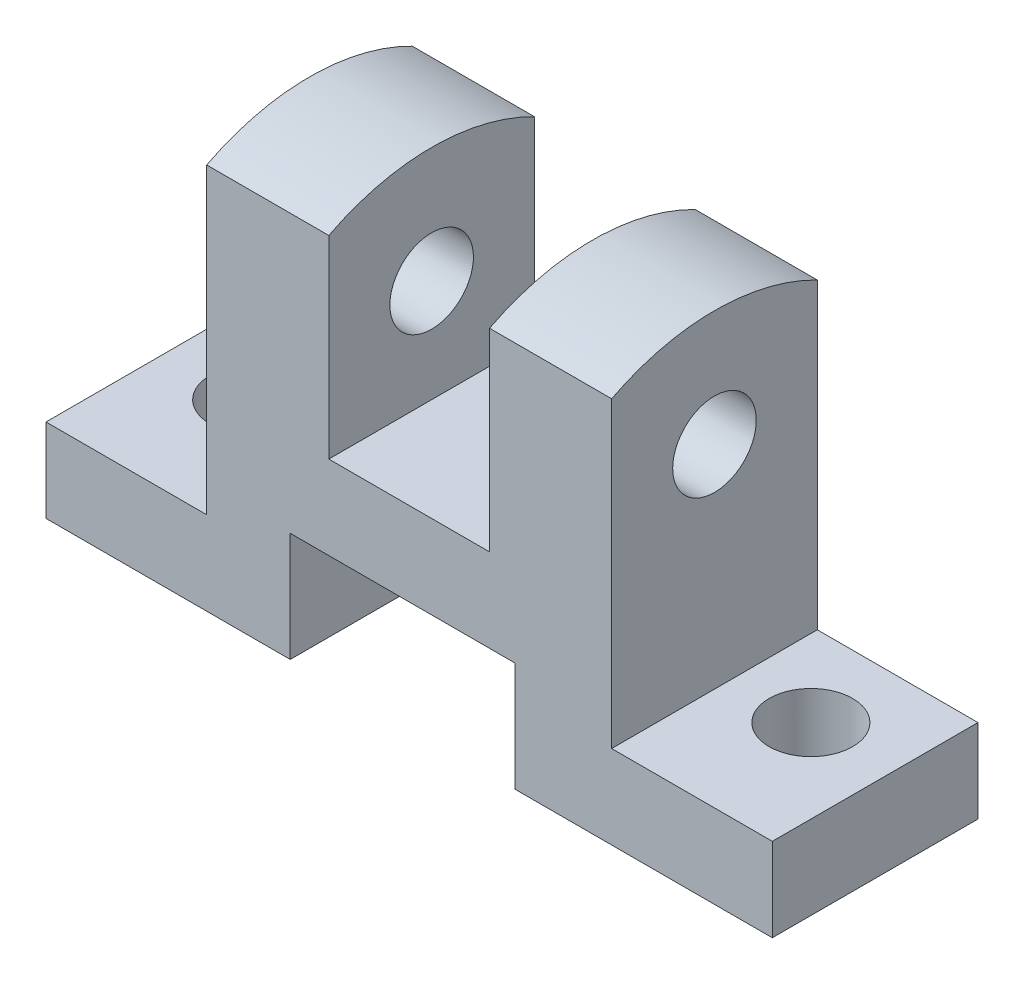
ISO-10303-21;
HEADER;
FILE_DESCRIPTION(('STEP AP214'),'2;1');
FILE_NAME('part.step','',(''),(''),'','','');
FILE_SCHEMA(('AUTOMOTIVE_DESIGN { 1 0 10303 214 1 1 1 1 }'));
ENDSEC;
DATA;
#1=APPLICATION_CONTEXT('core data for automotive mechanical design processes');
#2=APPLICATION_PROTOCOL_DEFINITION('international standard','automotive_design',2000,#1);
#3=PRODUCT_CONTEXT('',#1,'mechanical');
#4=PRODUCT('Part','Part','',(#3));
#5=PRODUCT_RELATED_PRODUCT_CATEGORY('part','',(#4));
#6=PRODUCT_DEFINITION_FORMATION('','',#4);
#7=PRODUCT_DEFINITION_CONTEXT('part definition',#1,'design');
#8=PRODUCT_DEFINITION('design','',#6,#7);
#9=PRODUCT_DEFINITION_SHAPE('','',#8);
#10=(LENGTH_UNIT() NAMED_UNIT(*) SI_UNIT(.MILLI.,.METRE.));
#11=(NAMED_UNIT(*) PLANE_ANGLE_UNIT() SI_UNIT($,.RADIAN.));
#12=(NAMED_UNIT(*) SI_UNIT($,.STERADIAN.) SOLID_ANGLE_UNIT());
#13=UNCERTAINTY_MEASURE_WITH_UNIT(LENGTH_MEASURE(1.E-05),#10,'distance_accuracy_value','');
#14=(GEOMETRIC_REPRESENTATION_CONTEXT(3) GLOBAL_UNCERTAINTY_ASSIGNED_CONTEXT((#13)) GLOBAL_UNIT_ASSIGNED_CONTEXT((#10,
#11,#12)) REPRESENTATION_CONTEXT('',''));
#15=CARTESIAN_POINT('',(0.,0.,0.));
#16=DIRECTION('',(0.,0.,1.));
#17=DIRECTION('',(1.,0.,0.));
#18=AXIS2_PLACEMENT_3D('',#15,#16,#17);
#19=CARTESIAN_POINT('',(23.1227868642223,-12.117917581086,32.));
#20=DIRECTION('',(-1.,0.,0.));
#21=DIRECTION('',(0.,0.,1.));
#22=AXIS2_PLACEMENT_3D('',#19,#20,#21);
#23=PLANE('',#22);
#24=CARTESIAN_POINT('',(23.1227868642223,20.882082418914,16.));
#25=DIRECTION('',(-1.,0.,0.));
#26=DIRECTION('',(0.,0.,1.));
#27=AXIS2_PLACEMENT_3D('',#24,#25,#26);
#28=CIRCLE('',#27,6.5);
#29=CARTESIAN_POINT('',(23.1227868642223,20.882082418914,22.5));
#30=VERTEX_POINT('',#29);
#31=EDGE_CURVE('E297',#30,#30,#28,.T.);
#32=ORIENTED_EDGE('',*,*,#31,.T.);
#33=EDGE_LOOP('',(#32));
#34=FACE_BOUND('',#33,.T.);
#35=DIRECTION('',(0.,1.,0.));
#36=VECTOR('',#35,1.);
#37=CARTESIAN_POINT('',(23.1227868642223,-12.117917581086,0.));
#38=LINE('',#37,#36);
#39=CARTESIAN_POINT('',(23.1227868642223,-12.117917581086,0.));
#40=VERTEX_POINT('',#39);
#41=CARTESIAN_POINT('',(23.1227868642223,35.0108472514607,0.));
#42=VERTEX_POINT('',#41);
#43=EDGE_CURVE('E271',#40,#42,#38,.T.);
#44=ORIENTED_EDGE('',*,*,#43,.T.);
#45=CARTESIAN_POINT('',(23.1227868642223,3.88208241891396,16.));
#46=DIRECTION('',(-1.,0.,0.));
#47=DIRECTION('',(0.,0.,1.));
#48=AXIS2_PLACEMENT_3D('',#45,#46,#47);
#49=CIRCLE('',#48,35.);
#50=CARTESIAN_POINT('',(23.1227868642223,35.0108472514607,32.));
#51=VERTEX_POINT('',#50);
#52=EDGE_CURVE('E284',#51,#42,#49,.T.);
#53=ORIENTED_EDGE('',*,*,#52,.F.);
#54=DIRECTION('',(0.,1.,0.));
#55=VECTOR('',#54,1.);
#56=CARTESIAN_POINT('',(23.1227868642223,-12.117917581086,32.));
#57=LINE('',#56,#55);
#58=CARTESIAN_POINT('',(23.1227868642223,-12.117917581086,32.));
#59=VERTEX_POINT('',#58);
#60=EDGE_CURVE('E239',#59,#51,#57,.T.);
#61=ORIENTED_EDGE('',*,*,#60,.F.);
#62=DIRECTION('',(0.,0.,-1.));
#63=VECTOR('',#62,1.);
#64=CARTESIAN_POINT('',(23.1227868642223,-12.117917581086,32.));
#65=LINE('',#64,#63);
#66=EDGE_CURVE('E216',#59,#40,#65,.T.);
#67=ORIENTED_EDGE('',*,*,#66,.T.);
#68=EDGE_LOOP('',(#44,#53,#61,#67));
#69=FACE_BOUND('',#68,.T.);
#70=ADVANCED_FACE('F35',(#34,#69),#23,.F.);
#71=CARTESIAN_POINT('',(4.12278686422227,38.882082418914,32.));
#72=DIRECTION('',(1.,0.,0.));
#73=DIRECTION('',(0.,1.,0.));
#74=AXIS2_PLACEMENT_3D('',#71,#72,#73);
#75=PLANE('',#74);
#76=CARTESIAN_POINT('',(4.12278686422227,20.882082418914,16.));
#77=DIRECTION('',(1.,0.,0.));
#78=DIRECTION('',(0.,1.,0.));
#79=AXIS2_PLACEMENT_3D('',#76,#77,#78);
#80=CIRCLE('',#79,6.5);
#81=CARTESIAN_POINT('',(4.12278686422227,27.382082418914,16.));
#82=VERTEX_POINT('',#81);
#83=EDGE_CURVE('E294',#82,#82,#80,.T.);
#84=ORIENTED_EDGE('',*,*,#83,.T.);
#85=EDGE_LOOP('',(#84));
#86=FACE_BOUND('',#85,.T.);
#87=CARTESIAN_POINT('',(4.12278686422227,3.88208241891396,16.));
#88=DIRECTION('',(1.,0.,0.));
#89=DIRECTION('',(0.,1.,0.));
#90=AXIS2_PLACEMENT_3D('',#87,#88,#89);
#91=CIRCLE('',#90,35.);
#92=CARTESIAN_POINT('',(4.12278686422227,35.0108472514607,0.));
#93=VERTEX_POINT('',#92);
#94=CARTESIAN_POINT('',(4.12278686422227,35.0108472514607,32.));
#95=VERTEX_POINT('',#94);
#96=EDGE_CURVE('E57',#93,#95,#91,.T.);
#97=ORIENTED_EDGE('',*,*,#96,.F.);
#98=DIRECTION('',(0.,-1.,0.));
#99=VECTOR('',#98,1.);
#100=CARTESIAN_POINT('',(4.12278686422227,38.882082418914,0.));
#101=LINE('',#100,#99);
#102=CARTESIAN_POINT('',(4.12278686422227,4.88208241891397,0.));
#103=VERTEX_POINT('',#102);
#104=EDGE_CURVE('E274',#93,#103,#101,.T.);
#105=ORIENTED_EDGE('',*,*,#104,.T.);
#106=DIRECTION('',(0.,0.,-1.));
#107=VECTOR('',#106,1.);
#108=CARTESIAN_POINT('',(4.12278686422227,4.88208241891397,32.));
#109=LINE('',#108,#107);
#110=CARTESIAN_POINT('',(4.12278686422227,4.88208241891397,32.));
#111=VERTEX_POINT('',#110);
#112=EDGE_CURVE('E213',#111,#103,#109,.T.);
#113=ORIENTED_EDGE('',*,*,#112,.F.);
#114=DIRECTION('',(0.,-1.,0.));
#115=VECTOR('',#114,1.);
#116=CARTESIAN_POINT('',(4.12278686422227,38.882082418914,32.));
#117=LINE('',#116,#115);
#118=EDGE_CURVE('E236',#95,#111,#117,.T.);
#119=ORIENTED_EDGE('',*,*,#118,.F.);
#120=EDGE_LOOP('',(#97,#105,#113,#119));
#121=FACE_BOUND('',#120,.T.);
#122=ADVANCED_FACE('F242',(#86,#121),#75,.F.);
#123=CARTESIAN_POINT('',(-20.8772131357777,4.88208241891397,32.));
#124=DIRECTION('',(-1.,0.,0.));
#125=DIRECTION('',(0.,-1.,0.));
#126=AXIS2_PLACEMENT_3D('',#123,#124,#125);
#127=PLANE('',#126);
#128=CARTESIAN_POINT('',(-20.8772131357777,20.882082418914,16.));
#129=DIRECTION('',(-1.,0.,0.));
#130=DIRECTION('',(0.,-1.,0.));
#131=AXIS2_PLACEMENT_3D('',#128,#129,#130);
#132=CIRCLE('',#131,6.5);
#133=CARTESIAN_POINT('',(-20.8772131357777,14.382082418914,16.));
#134=VERTEX_POINT('',#133);
#135=EDGE_CURVE('E291',#134,#134,#132,.T.);
#136=ORIENTED_EDGE('',*,*,#135,.T.);
#137=EDGE_LOOP('',(#136));
#138=FACE_BOUND('',#137,.T.);
#139=DIRECTION('',(0.,1.,0.));
#140=VECTOR('',#139,1.);
#141=CARTESIAN_POINT('',(-20.8772131357777,4.88208241891397,0.));
#142=LINE('',#141,#140);
#143=CARTESIAN_POINT('',(-20.8772131357777,4.88208241891397,0.));
#144=VERTEX_POINT('',#143);
#145=CARTESIAN_POINT('',(-20.8772131357777,35.0108472514607,0.));
#146=VERTEX_POINT('',#145);
#147=EDGE_CURVE('E166',#144,#146,#142,.T.);
#148=ORIENTED_EDGE('',*,*,#147,.T.);
#149=CARTESIAN_POINT('',(-20.8772131357777,3.88208241891396,16.));
#150=DIRECTION('',(-1.,0.,0.));
#151=DIRECTION('',(0.,-1.,0.));
#152=AXIS2_PLACEMENT_3D('',#149,#150,#151);
#153=CIRCLE('',#152,35.);
#154=CARTESIAN_POINT('',(-20.8772131357777,35.0108472514607,32.));
#155=VERTEX_POINT('',#154);
#156=EDGE_CURVE('E152',#155,#146,#153,.T.);
#157=ORIENTED_EDGE('',*,*,#156,.F.);
#158=DIRECTION('',(0.,1.,0.));
#159=VECTOR('',#158,1.);
#160=CARTESIAN_POINT('',(-20.8772131357777,4.88208241891397,32.));
#161=LINE('',#160,#159);
#162=CARTESIAN_POINT('',(-20.8772131357777,4.88208241891397,32.));
#163=VERTEX_POINT('',#162);
#164=EDGE_CURVE('E246',#163,#155,#161,.T.);
#165=ORIENTED_EDGE('',*,*,#164,.F.);
#166=DIRECTION('',(0.,0.,-1.));
#167=VECTOR('',#166,1.);
#168=CARTESIAN_POINT('',(-20.8772131357777,4.88208241891397,32.));
#169=LINE('',#168,#167);
#170=EDGE_CURVE('E210',#163,#144,#169,.T.);
#171=ORIENTED_EDGE('',*,*,#170,.T.);
#172=EDGE_LOOP('',(#148,#157,#165,#171));
#173=FACE_BOUND('',#172,.T.);
#174=ADVANCED_FACE('F282',(#138,#173),#127,.F.);
#175=CARTESIAN_POINT('',(-39.8772131357777,38.882082418914,32.));
#176=DIRECTION('',(1.,0.,0.));
#177=DIRECTION('',(0.,1.,0.));
#178=AXIS2_PLACEMENT_3D('',#175,#176,#177);
#179=PLANE('',#178);
#180=CARTESIAN_POINT('',(-39.8772131357777,20.882082418914,16.));
#181=DIRECTION('',(-1.,0.,0.));
#182=DIRECTION('',(0.,-1.,0.));
#183=AXIS2_PLACEMENT_3D('',#180,#181,#182);
#184=CIRCLE('',#183,6.5);
#185=CARTESIAN_POINT('',(-39.8772131357777,14.382082418914,16.));
#186=VERTEX_POINT('',#185);
#187=EDGE_CURVE('E288',#186,#186,#184,.T.);
#188=ORIENTED_EDGE('',*,*,#187,.F.);
#189=EDGE_LOOP('',(#188));
#190=FACE_BOUND('',#189,.T.);
#191=CARTESIAN_POINT('',(-39.8772131357777,3.88208241891396,16.));
#192=DIRECTION('',(1.,0.,0.));
#193=DIRECTION('',(0.,1.,0.));
#194=AXIS2_PLACEMENT_3D('',#191,#192,#193);
#195=CIRCLE('',#194,35.);
#196=CARTESIAN_POINT('',(-39.8772131357777,35.0108472514607,0.));
#197=VERTEX_POINT('',#196);
#198=CARTESIAN_POINT('',(-39.8772131357777,35.0108472514607,32.));
#199=VERTEX_POINT('',#198);
#200=EDGE_CURVE('E50',#197,#199,#195,.T.);
#201=ORIENTED_EDGE('',*,*,#200,.F.);
#202=DIRECTION('',(0.,-1.,0.));
#203=VECTOR('',#202,1.);
#204=CARTESIAN_POINT('',(-39.8772131357777,38.882082418914,0.));
#205=LINE('',#204,#203);
#206=CARTESIAN_POINT('',(-39.8772131357777,-12.117917581086,0.));
#207=VERTEX_POINT('',#206);
#208=EDGE_CURVE('E149',#197,#207,#205,.T.);
#209=ORIENTED_EDGE('',*,*,#208,.T.);
#210=DIRECTION('',(0.,0.,-1.));
#211=VECTOR('',#210,1.);
#212=CARTESIAN_POINT('',(-39.8772131357777,-12.117917581086,32.));
#213=LINE('',#212,#211);
#214=CARTESIAN_POINT('',(-39.8772131357777,-12.117917581086,32.));
#215=VERTEX_POINT('',#214);
#216=EDGE_CURVE('E208',#215,#207,#213,.T.);
#217=ORIENTED_EDGE('',*,*,#216,.F.);
#218=DIRECTION('',(0.,-1.,0.));
#219=VECTOR('',#218,1.);
#220=CARTESIAN_POINT('',(-39.8772131357777,38.882082418914,32.));
#221=LINE('',#220,#219);
#222=EDGE_CURVE('E151',#199,#215,#221,.T.);
#223=ORIENTED_EDGE('',*,*,#222,.F.);
#224=EDGE_LOOP('',(#201,#209,#217,#223));
#225=FACE_BOUND('',#224,.T.);
#226=ADVANCED_FACE('F146',(#190,#225),#179,.F.);
#227=CARTESIAN_POINT('',(0.,0.,0.));
#228=DIRECTION('',(0.,0.,1.));
#229=DIRECTION('',(1.,0.,0.));
#230=AXIS2_PLACEMENT_3D('',#227,#228,#229);
#231=PLANE('',#230);
#232=DIRECTION('',(1.,0.,0.));
#233=VECTOR('',#232,1.);
#234=CARTESIAN_POINT('',(-64.8772131357777,35.0108472514607,0.));
#235=LINE('',#234,#233);
#236=EDGE_CURVE('E11',#42,#93,#235,.F.);
#237=ORIENTED_EDGE('',*,*,#236,.F.);
#238=ORIENTED_EDGE('',*,*,#43,.F.);
#239=DIRECTION('',(-1.,0.,0.));
#240=VECTOR('',#239,1.);
#241=CARTESIAN_POINT('',(48.1227868642223,-12.117917581086,0.));
#242=LINE('',#241,#240);
#243=CARTESIAN_POINT('',(48.1227868642223,-12.117917581086,0.));
#244=VERTEX_POINT('',#243);
#245=EDGE_CURVE('E269',#244,#40,#242,.T.);
#246=ORIENTED_EDGE('',*,*,#245,.F.);
#247=DIRECTION('',(0.,1.,0.));
#248=VECTOR('',#247,1.);
#249=CARTESIAN_POINT('',(48.1227868642223,-25.117917581086,0.));
#250=LINE('',#249,#248);
#251=CARTESIAN_POINT('',(48.1227868642223,-25.117917581086,0.));
#252=VERTEX_POINT('',#251);
#253=EDGE_CURVE('E226',#252,#244,#250,.T.);
#254=ORIENTED_EDGE('',*,*,#253,.F.);
#255=DIRECTION('',(1.,0.,0.));
#256=VECTOR('',#255,1.);
#257=CARTESIAN_POINT('',(8.12278686422227,-25.117917581086,0.));
#258=LINE('',#257,#256);
#259=CARTESIAN_POINT('',(8.12278686422227,-25.117917581086,0.));
#260=VERTEX_POINT('',#259);
#261=EDGE_CURVE('E183',#260,#252,#258,.T.);
#262=ORIENTED_EDGE('',*,*,#261,.F.);
#263=DIRECTION('',(0.,-1.,0.));
#264=VECTOR('',#263,1.);
#265=CARTESIAN_POINT('',(8.12278686422227,-8.11791758108603,0.));
#266=LINE('',#265,#264);
#267=CARTESIAN_POINT('',(8.12278686422227,-8.11791758108603,0.));
#268=VERTEX_POINT('',#267);
#269=EDGE_CURVE('E181',#268,#260,#266,.T.);
#270=ORIENTED_EDGE('',*,*,#269,.F.);
#271=DIRECTION('',(1.,0.,0.));
#272=VECTOR('',#271,1.);
#273=CARTESIAN_POINT('',(-26.8772131357777,-8.11791758108603,0.));
#274=LINE('',#273,#272);
#275=CARTESIAN_POINT('',(-26.8772131357777,-8.11791758108603,0.));
#276=VERTEX_POINT('',#275);
#277=EDGE_CURVE('E179',#276,#268,#274,.T.);
#278=ORIENTED_EDGE('',*,*,#277,.F.);
#279=DIRECTION('',(0.,1.,0.));
#280=VECTOR('',#279,1.);
#281=CARTESIAN_POINT('',(-26.8772131357777,-25.117917581086,0.));
#282=LINE('',#281,#280);
#283=CARTESIAN_POINT('',(-26.8772131357777,-25.117917581086,0.));
#284=VERTEX_POINT('',#283);
#285=EDGE_CURVE('E177',#284,#276,#282,.T.);
#286=ORIENTED_EDGE('',*,*,#285,.F.);
#287=DIRECTION('',(1.,0.,0.));
#288=VECTOR('',#287,1.);
#289=CARTESIAN_POINT('',(-64.8772131357777,-25.117917581086,0.));
#290=LINE('',#289,#288);
#291=CARTESIAN_POINT('',(-64.8772131357777,-25.117917581086,0.));
#292=VERTEX_POINT('',#291);
#293=EDGE_CURVE('E175',#292,#284,#290,.T.);
#294=ORIENTED_EDGE('',*,*,#293,.F.);
#295=DIRECTION('',(0.,-1.,0.));
#296=VECTOR('',#295,1.);
#297=CARTESIAN_POINT('',(-64.8772131357777,-12.117917581086,0.));
#298=LINE('',#297,#296);
#299=CARTESIAN_POINT('',(-64.8772131357777,-12.117917581086,0.));
#300=VERTEX_POINT('',#299);
#301=EDGE_CURVE('E168',#300,#292,#298,.T.);
#302=ORIENTED_EDGE('',*,*,#301,.F.);
#303=DIRECTION('',(-1.,0.,0.));
#304=VECTOR('',#303,1.);
#305=CARTESIAN_POINT('',(-39.8772131357777,-12.117917581086,0.));
#306=LINE('',#305,#304);
#307=EDGE_CURVE('E165',#207,#300,#306,.T.);
#308=ORIENTED_EDGE('',*,*,#307,.F.);
#309=ORIENTED_EDGE('',*,*,#208,.F.);
#310=EDGE_CURVE('E39',#146,#197,#235,.F.);
#311=ORIENTED_EDGE('',*,*,#310,.F.);
#312=ORIENTED_EDGE('',*,*,#147,.F.);
#313=DIRECTION('',(-1.,0.,0.));
#314=VECTOR('',#313,1.);
#315=CARTESIAN_POINT('',(4.12278686422227,4.88208241891397,0.));
#316=LINE('',#315,#314);
#317=EDGE_CURVE('E170',#103,#144,#316,.T.);
#318=ORIENTED_EDGE('',*,*,#317,.F.);
#319=ORIENTED_EDGE('',*,*,#104,.F.);
#320=EDGE_LOOP('',(#237,#238,#246,#254,#262,#270,#278,#286,#294,#302,#308,#309,#311,#312,#318,#319));
#321=FACE_BOUND('',#320,.T.);
#322=ADVANCED_FACE('F163',(#321),#231,.F.);
#323=CARTESIAN_POINT('',(0.,0.,32.));
#324=DIRECTION('',(0.,0.,1.));
#325=DIRECTION('',(1.,0.,0.));
#326=AXIS2_PLACEMENT_3D('',#323,#324,#325);
#327=PLANE('',#326);
#328=ORIENTED_EDGE('',*,*,#60,.T.);
#329=DIRECTION('',(1.,0.,0.));
#330=VECTOR('',#329,1.);
#331=CARTESIAN_POINT('',(-64.8772131357777,35.0108472514607,32.));
#332=LINE('',#331,#330);
#333=EDGE_CURVE('E160',#51,#95,#332,.F.);
#334=ORIENTED_EDGE('',*,*,#333,.T.);
#335=ORIENTED_EDGE('',*,*,#118,.T.);
#336=DIRECTION('',(-1.,0.,0.));
#337=VECTOR('',#336,1.);
#338=CARTESIAN_POINT('',(4.12278686422227,4.88208241891397,32.));
#339=LINE('',#338,#337);
#340=EDGE_CURVE('E244',#111,#163,#339,.T.);
#341=ORIENTED_EDGE('',*,*,#340,.T.);
#342=ORIENTED_EDGE('',*,*,#164,.T.);
#343=EDGE_CURVE('E222',#155,#199,#332,.F.);
#344=ORIENTED_EDGE('',*,*,#343,.T.);
#345=ORIENTED_EDGE('',*,*,#222,.T.);
#346=DIRECTION('',(-1.,0.,0.));
#347=VECTOR('',#346,1.);
#348=CARTESIAN_POINT('',(-39.8772131357777,-12.117917581086,32.));
#349=LINE('',#348,#347);
#350=CARTESIAN_POINT('',(-64.8772131357777,-12.117917581086,32.));
#351=VERTEX_POINT('',#350);
#352=EDGE_CURVE('E254',#215,#351,#349,.T.);
#353=ORIENTED_EDGE('',*,*,#352,.T.);
#354=DIRECTION('',(0.,-1.,0.));
#355=VECTOR('',#354,1.);
#356=CARTESIAN_POINT('',(-64.8772131357777,-12.117917581086,32.));
#357=LINE('',#356,#355);
#358=CARTESIAN_POINT('',(-64.8772131357777,-25.117917581086,32.));
#359=VERTEX_POINT('',#358);
#360=EDGE_CURVE('E256',#351,#359,#357,.T.);
#361=ORIENTED_EDGE('',*,*,#360,.T.);
#362=DIRECTION('',(1.,0.,0.));
#363=VECTOR('',#362,1.);
#364=CARTESIAN_POINT('',(-64.8772131357777,-25.117917581086,32.));
#365=LINE('',#364,#363);
#366=CARTESIAN_POINT('',(-26.8772131357777,-25.117917581086,32.));
#367=VERTEX_POINT('',#366);
#368=EDGE_CURVE('E258',#359,#367,#365,.T.);
#369=ORIENTED_EDGE('',*,*,#368,.T.);
#370=DIRECTION('',(0.,1.,0.));
#371=VECTOR('',#370,1.);
#372=CARTESIAN_POINT('',(-26.8772131357777,-25.117917581086,32.));
#373=LINE('',#372,#371);
#374=CARTESIAN_POINT('',(-26.8772131357777,-8.11791758108603,32.));
#375=VERTEX_POINT('',#374);
#376=EDGE_CURVE('E260',#367,#375,#373,.T.);
#377=ORIENTED_EDGE('',*,*,#376,.T.);
#378=DIRECTION('',(1.,0.,0.));
#379=VECTOR('',#378,1.);
#380=CARTESIAN_POINT('',(-26.8772131357777,-8.11791758108603,32.));
#381=LINE('',#380,#379);
#382=CARTESIAN_POINT('',(8.12278686422227,-8.11791758108603,32.));
#383=VERTEX_POINT('',#382);
#384=EDGE_CURVE('E262',#375,#383,#381,.T.);
#385=ORIENTED_EDGE('',*,*,#384,.T.);
#386=DIRECTION('',(0.,-1.,0.));
#387=VECTOR('',#386,1.);
#388=CARTESIAN_POINT('',(8.12278686422227,-8.11791758108603,32.));
#389=LINE('',#388,#387);
#390=CARTESIAN_POINT('',(8.12278686422227,-25.117917581086,32.));
#391=VERTEX_POINT('',#390);
#392=EDGE_CURVE('E264',#383,#391,#389,.T.);
#393=ORIENTED_EDGE('',*,*,#392,.T.);
#394=DIRECTION('',(1.,0.,0.));
#395=VECTOR('',#394,1.);
#396=CARTESIAN_POINT('',(8.12278686422227,-25.117917581086,32.));
#397=LINE('',#396,#395);
#398=CARTESIAN_POINT('',(48.1227868642223,-25.117917581086,32.));
#399=VERTEX_POINT('',#398);
#400=EDGE_CURVE('E190',#391,#399,#397,.T.);
#401=ORIENTED_EDGE('',*,*,#400,.T.);
#402=DIRECTION('',(0.,1.,0.));
#403=VECTOR('',#402,1.);
#404=CARTESIAN_POINT('',(48.1227868642223,-25.117917581086,32.));
#405=LINE('',#404,#403);
#406=CARTESIAN_POINT('',(48.1227868642223,-12.117917581086,32.));
#407=VERTEX_POINT('',#406);
#408=EDGE_CURVE('E185',#399,#407,#405,.T.);
#409=ORIENTED_EDGE('',*,*,#408,.T.);
#410=DIRECTION('',(-1.,0.,0.));
#411=VECTOR('',#410,1.);
#412=CARTESIAN_POINT('',(48.1227868642223,-12.117917581086,32.));
#413=LINE('',#412,#411);
#414=EDGE_CURVE('E248',#407,#59,#413,.T.);
#415=ORIENTED_EDGE('',*,*,#414,.T.);
#416=EDGE_LOOP('',(#328,#334,#335,#341,#342,#344,#345,#353,#361,#369,#377,#385,#393,#401,#409,#415));
#417=FACE_BOUND('',#416,.T.);
#418=ADVANCED_FACE('F235',(#417),#327,.T.);
#419=CARTESIAN_POINT('',(-39.8772131357777,-12.117917581086,32.));
#420=DIRECTION('',(0.,-1.,0.));
#421=DIRECTION('',(1.,0.,0.));
#422=AXIS2_PLACEMENT_3D('',#419,#420,#421);
#423=PLANE('',#422);
#424=ORIENTED_EDGE('',*,*,#307,.T.);
#425=DIRECTION('',(0.,0.,-1.));
#426=VECTOR('',#425,1.);
#427=CARTESIAN_POINT('',(-64.8772131357777,-12.117917581086,32.));
#428=LINE('',#427,#426);
#429=EDGE_CURVE('E205',#351,#300,#428,.T.);
#430=ORIENTED_EDGE('',*,*,#429,.F.);
#431=ORIENTED_EDGE('',*,*,#352,.F.);
#432=ORIENTED_EDGE('',*,*,#216,.T.);
#433=EDGE_LOOP('',(#424,#430,#431,#432));
#434=FACE_BOUND('',#433,.T.);
#435=CARTESIAN_POINT('',(-51.8772131357777,-12.117917581086,13.));
#436=DIRECTION('',(0.,-1.,0.));
#437=DIRECTION('',(1.,0.,0.));
#438=AXIS2_PLACEMENT_3D('',#435,#436,#437);
#439=CIRCLE('',#438,6.5);
#440=CARTESIAN_POINT('',(-45.3772131357777,-12.117917581086,13.));
#441=VERTEX_POINT('',#440);
#442=EDGE_CURVE('E230',#441,#441,#439,.T.);
#443=ORIENTED_EDGE('',*,*,#442,.T.);
#444=EDGE_LOOP('',(#443));
#445=FACE_BOUND('',#444,.T.);
#446=ADVANCED_FACE('F348',(#434,#445),#423,.F.);
#447=CARTESIAN_POINT('',(-64.8772131357777,-25.117917581086,32.));
#448=DIRECTION('',(0.,1.,0.));
#449=DIRECTION('',(0.,0.,1.));
#450=AXIS2_PLACEMENT_3D('',#447,#448,#449);
#451=PLANE('',#450);
#452=ORIENTED_EDGE('',*,*,#293,.T.);
#453=DIRECTION('',(0.,0.,-1.));
#454=VECTOR('',#453,1.);
#455=CARTESIAN_POINT('',(-26.8772131357777,-25.117917581086,32.));
#456=LINE('',#455,#454);
#457=EDGE_CURVE('E199',#367,#284,#456,.T.);
#458=ORIENTED_EDGE('',*,*,#457,.F.);
#459=ORIENTED_EDGE('',*,*,#368,.F.);
#460=DIRECTION('',(0.,0.,-1.));
#461=VECTOR('',#460,1.);
#462=CARTESIAN_POINT('',(-64.8772131357777,-25.117917581086,32.));
#463=LINE('',#462,#461);
#464=EDGE_CURVE('E202',#359,#292,#463,.T.);
#465=ORIENTED_EDGE('',*,*,#464,.T.);
#466=EDGE_LOOP('',(#452,#458,#459,#465));
#467=FACE_BOUND('',#466,.T.);
#468=CARTESIAN_POINT('',(-51.8772131357777,-25.117917581086,13.));
#469=DIRECTION('',(0.,1.,0.));
#470=DIRECTION('',(0.,0.,1.));
#471=AXIS2_PLACEMENT_3D('',#468,#469,#470);
#472=CIRCLE('',#471,6.5);
#473=CARTESIAN_POINT('',(-51.8772131357777,-25.117917581086,19.5));
#474=VERTEX_POINT('',#473);
#475=EDGE_CURVE('E228',#474,#474,#472,.F.);
#476=ORIENTED_EDGE('',*,*,#475,.F.);
#477=EDGE_LOOP('',(#476));
#478=FACE_BOUND('',#477,.T.);
#479=ADVANCED_FACE('F338',(#467,#478),#451,.F.);
#480=CARTESIAN_POINT('',(48.1227868642223,-25.117917581086,32.));
#481=DIRECTION('',(-1.,0.,0.));
#482=DIRECTION('',(0.,0.,1.));
#483=AXIS2_PLACEMENT_3D('',#480,#481,#482);
#484=PLANE('',#483);
#485=ORIENTED_EDGE('',*,*,#253,.T.);
#486=DIRECTION('',(0.,0.,-1.));
#487=VECTOR('',#486,1.);
#488=CARTESIAN_POINT('',(48.1227868642223,-12.117917581086,32.));
#489=LINE('',#488,#487);
#490=EDGE_CURVE('E219',#407,#244,#489,.T.);
#491=ORIENTED_EDGE('',*,*,#490,.F.);
#492=ORIENTED_EDGE('',*,*,#408,.F.);
#493=DIRECTION('',(0.,0.,-1.));
#494=VECTOR('',#493,1.);
#495=CARTESIAN_POINT('',(48.1227868642223,-25.117917581086,32.));
#496=LINE('',#495,#494);
#497=EDGE_CURVE('E186',#399,#252,#496,.T.);
#498=ORIENTED_EDGE('',*,*,#497,.T.);
#499=EDGE_LOOP('',(#485,#491,#492,#498));
#500=FACE_BOUND('',#499,.T.);
#501=ADVANCED_FACE('F37',(#500),#484,.F.);
#502=CARTESIAN_POINT('',(48.1227868642223,-12.117917581086,32.));
#503=DIRECTION('',(0.,-1.,0.));
#504=DIRECTION('',(1.,0.,0.));
#505=AXIS2_PLACEMENT_3D('',#502,#503,#504);
#506=PLANE('',#505);
#507=CARTESIAN_POINT('',(35.1227868642223,-12.117917581086,13.));
#508=DIRECTION('',(0.,1.,0.));
#509=DIRECTION('',(-1.,0.,0.));
#510=AXIS2_PLACEMENT_3D('',#507,#508,#509);
#511=CIRCLE('',#510,6.5);
#512=CARTESIAN_POINT('',(28.6227868642223,-12.117917581086,13.));
#513=VERTEX_POINT('',#512);
#514=EDGE_CURVE('E227',#513,#513,#511,.T.);
#515=ORIENTED_EDGE('',*,*,#514,.F.);
#516=EDGE_LOOP('',(#515));
#517=FACE_BOUND('',#516,.T.);
#518=ORIENTED_EDGE('',*,*,#245,.T.);
#519=ORIENTED_EDGE('',*,*,#66,.F.);
#520=ORIENTED_EDGE('',*,*,#414,.F.);
#521=ORIENTED_EDGE('',*,*,#490,.T.);
#522=EDGE_LOOP('',(#518,#519,#520,#521));
#523=FACE_BOUND('',#522,.T.);
#524=ADVANCED_FACE('F309',(#517,#523),#506,.F.);
#525=CARTESIAN_POINT('',(4.12278686422227,4.88208241891397,32.));
#526=DIRECTION('',(0.,-1.,0.));
#527=DIRECTION('',(1.,0.,0.));
#528=AXIS2_PLACEMENT_3D('',#525,#526,#527);
#529=PLANE('',#528);
#530=ORIENTED_EDGE('',*,*,#317,.T.);
#531=ORIENTED_EDGE('',*,*,#170,.F.);
#532=ORIENTED_EDGE('',*,*,#340,.F.);
#533=ORIENTED_EDGE('',*,*,#112,.T.);
#534=EDGE_LOOP('',(#530,#531,#532,#533));
#535=FACE_BOUND('',#534,.T.);
#536=ADVANCED_FACE('F278',(#535),#529,.F.);
#537=CARTESIAN_POINT('',(-64.8772131357777,-12.117917581086,32.));
#538=DIRECTION('',(1.,0.,0.));
#539=DIRECTION('',(0.,0.,-1.));
#540=AXIS2_PLACEMENT_3D('',#537,#538,#539);
#541=PLANE('',#540);
#542=ORIENTED_EDGE('',*,*,#301,.T.);
#543=ORIENTED_EDGE('',*,*,#464,.F.);
#544=ORIENTED_EDGE('',*,*,#360,.F.);
#545=ORIENTED_EDGE('',*,*,#429,.T.);
#546=EDGE_LOOP('',(#542,#543,#544,#545));
#547=FACE_BOUND('',#546,.T.);
#548=ADVANCED_FACE('F344',(#547),#541,.F.);
#549=CARTESIAN_POINT('',(-26.8772131357777,-25.117917581086,32.));
#550=DIRECTION('',(-1.,0.,0.));
#551=DIRECTION('',(0.,0.,1.));
#552=AXIS2_PLACEMENT_3D('',#549,#550,#551);
#553=PLANE('',#552);
#554=ORIENTED_EDGE('',*,*,#285,.T.);
#555=DIRECTION('',(0.,0.,-1.));
#556=VECTOR('',#555,1.);
#557=CARTESIAN_POINT('',(-26.8772131357777,-8.11791758108603,32.));
#558=LINE('',#557,#556);
#559=EDGE_CURVE('E196',#375,#276,#558,.T.);
#560=ORIENTED_EDGE('',*,*,#559,.F.);
#561=ORIENTED_EDGE('',*,*,#376,.F.);
#562=ORIENTED_EDGE('',*,*,#457,.T.);
#563=EDGE_LOOP('',(#554,#560,#561,#562));
#564=FACE_BOUND('',#563,.T.);
#565=ADVANCED_FACE('F334',(#564),#553,.F.);
#566=CARTESIAN_POINT('',(-26.8772131357777,-8.11791758108603,32.));
#567=DIRECTION('',(0.,1.,0.));
#568=DIRECTION('',(-1.,0.,0.));
#569=AXIS2_PLACEMENT_3D('',#566,#567,#568);
#570=PLANE('',#569);
#571=ORIENTED_EDGE('',*,*,#277,.T.);
#572=DIRECTION('',(0.,0.,-1.));
#573=VECTOR('',#572,1.);
#574=CARTESIAN_POINT('',(8.12278686422227,-8.11791758108603,32.));
#575=LINE('',#574,#573);
#576=EDGE_CURVE('E193',#383,#268,#575,.T.);
#577=ORIENTED_EDGE('',*,*,#576,.F.);
#578=ORIENTED_EDGE('',*,*,#384,.F.);
#579=ORIENTED_EDGE('',*,*,#559,.T.);
#580=EDGE_LOOP('',(#571,#577,#578,#579));
#581=FACE_BOUND('',#580,.T.);
#582=ADVANCED_FACE('F330',(#581),#570,.F.);
#583=CARTESIAN_POINT('',(8.12278686422227,-8.11791758108603,32.));
#584=DIRECTION('',(1.,0.,0.));
#585=DIRECTION('',(0.,0.,-1.));
#586=AXIS2_PLACEMENT_3D('',#583,#584,#585);
#587=PLANE('',#586);
#588=ORIENTED_EDGE('',*,*,#269,.T.);
#589=DIRECTION('',(0.,0.,-1.));
#590=VECTOR('',#589,1.);
#591=CARTESIAN_POINT('',(8.12278686422227,-25.117917581086,32.));
#592=LINE('',#591,#590);
#593=EDGE_CURVE('E189',#391,#260,#592,.T.);
#594=ORIENTED_EDGE('',*,*,#593,.F.);
#595=ORIENTED_EDGE('',*,*,#392,.F.);
#596=ORIENTED_EDGE('',*,*,#576,.T.);
#597=EDGE_LOOP('',(#588,#594,#595,#596));
#598=FACE_BOUND('',#597,.T.);
#599=ADVANCED_FACE('F325',(#598),#587,.F.);
#600=CARTESIAN_POINT('',(8.12278686422227,-25.117917581086,32.));
#601=DIRECTION('',(0.,1.,0.));
#602=DIRECTION('',(0.,0.,1.));
#603=AXIS2_PLACEMENT_3D('',#600,#601,#602);
#604=PLANE('',#603);
#605=CARTESIAN_POINT('',(35.1227868642223,-25.117917581086,13.));
#606=DIRECTION('',(0.,1.,0.));
#607=DIRECTION('',(0.,0.,1.));
#608=AXIS2_PLACEMENT_3D('',#605,#606,#607);
#609=CIRCLE('',#608,6.5);
#610=CARTESIAN_POINT('',(35.1227868642223,-25.117917581086,19.5));
#611=VERTEX_POINT('',#610);
#612=EDGE_CURVE('E223',#611,#611,#609,.T.);
#613=ORIENTED_EDGE('',*,*,#612,.T.);
#614=EDGE_LOOP('',(#613));
#615=FACE_BOUND('',#614,.T.);
#616=ORIENTED_EDGE('',*,*,#261,.T.);
#617=ORIENTED_EDGE('',*,*,#497,.F.);
#618=ORIENTED_EDGE('',*,*,#400,.F.);
#619=ORIENTED_EDGE('',*,*,#593,.T.);
#620=EDGE_LOOP('',(#616,#617,#618,#619));
#621=FACE_BOUND('',#620,.T.);
#622=ADVANCED_FACE('F319',(#615,#621),#604,.F.);
#623=CARTESIAN_POINT('',(35.1227868642223,-44.117917581086,13.));
#624=DIRECTION('',(0.,1.,0.));
#625=DIRECTION('',(-1.,0.,0.));
#626=AXIS2_PLACEMENT_3D('',#623,#624,#625);
#627=CYLINDRICAL_SURFACE('',#626,6.5);
#628=ORIENTED_EDGE('',*,*,#514,.T.);
#629=EDGE_LOOP('',(#628));
#630=FACE_BOUND('',#629,.T.);
#631=ORIENTED_EDGE('',*,*,#612,.F.);
#632=EDGE_LOOP('',(#631));
#633=FACE_BOUND('',#632,.T.);
#634=ADVANCED_FACE('F358',(#630,#633),#627,.F.);
#635=CARTESIAN_POINT('',(-51.8772131357777,-44.117917581086,13.));
#636=DIRECTION('',(0.,1.,0.));
#637=DIRECTION('',(-1.,0.,0.));
#638=AXIS2_PLACEMENT_3D('',#635,#636,#637);
#639=CYLINDRICAL_SURFACE('',#638,6.5);
#640=ORIENTED_EDGE('',*,*,#442,.F.);
#641=EDGE_LOOP('',(#640));
#642=FACE_BOUND('',#641,.T.);
#643=ORIENTED_EDGE('',*,*,#475,.T.);
#644=EDGE_LOOP('',(#643));
#645=FACE_BOUND('',#644,.T.);
#646=ADVANCED_FACE('F354',(#642,#645),#639,.F.);
#647=CARTESIAN_POINT('',(36.1227868642223,20.882082418914,16.));
#648=DIRECTION('',(-1.,0.,0.));
#649=DIRECTION('',(0.,-1.,0.));
#650=AXIS2_PLACEMENT_3D('',#647,#648,#649);
#651=CYLINDRICAL_SURFACE('',#650,6.5);
#652=ORIENTED_EDGE('',*,*,#187,.T.);
#653=EDGE_LOOP('',(#652));
#654=FACE_BOUND('',#653,.T.);
#655=ORIENTED_EDGE('',*,*,#135,.F.);
#656=EDGE_LOOP('',(#655));
#657=FACE_BOUND('',#656,.T.);
#658=ADVANCED_FACE('F357',(#654,#657),#651,.F.);
#659=ORIENTED_EDGE('',*,*,#83,.F.);
#660=EDGE_LOOP('',(#659));
#661=FACE_BOUND('',#660,.T.);
#662=ORIENTED_EDGE('',*,*,#31,.F.);
#663=EDGE_LOOP('',(#662));
#664=FACE_BOUND('',#663,.T.);
#665=ADVANCED_FACE('F416',(#661,#664),#651,.F.);
#666=CARTESIAN_POINT('',(-64.8772131357777,3.88208241891396,16.));
#667=DIRECTION('',(1.,0.,0.));
#668=DIRECTION('',(0.,0.,-1.));
#669=AXIS2_PLACEMENT_3D('',#666,#667,#668);
#670=CYLINDRICAL_SURFACE('',#669,35.);
#671=ORIENTED_EDGE('',*,*,#156,.T.);
#672=ORIENTED_EDGE('',*,*,#310,.T.);
#673=ORIENTED_EDGE('',*,*,#200,.T.);
#674=ORIENTED_EDGE('',*,*,#343,.F.);
#675=EDGE_LOOP('',(#671,#672,#673,#674));
#676=FACE_BOUND('',#675,.T.);
#677=ADVANCED_FACE('F155',(#676),#670,.T.);
#678=ORIENTED_EDGE('',*,*,#52,.T.);
#679=ORIENTED_EDGE('',*,*,#236,.T.);
#680=ORIENTED_EDGE('',*,*,#96,.T.);
#681=ORIENTED_EDGE('',*,*,#333,.F.);
#682=EDGE_LOOP('',(#678,#679,#680,#681));
#683=FACE_BOUND('',#682,.T.);
#684=ADVANCED_FACE('F312',(#683),#670,.T.);
#685=CLOSED_SHELL('',(#70,#122,#174,#226,#322,#418,#446,#479,#501,#524,#536,#548,#565,#582,#599,
#622,#634,#646,#658,#665,#677,#684));
#686=MANIFOLD_SOLID_BREP('B2',#685);
#687=ADVANCED_BREP_SHAPE_REPRESENTATION('',(#18,#686),#14);
#688=SHAPE_DEFINITION_REPRESENTATION(#9,#687);
ENDSEC;
END-ISO-10303-21;
